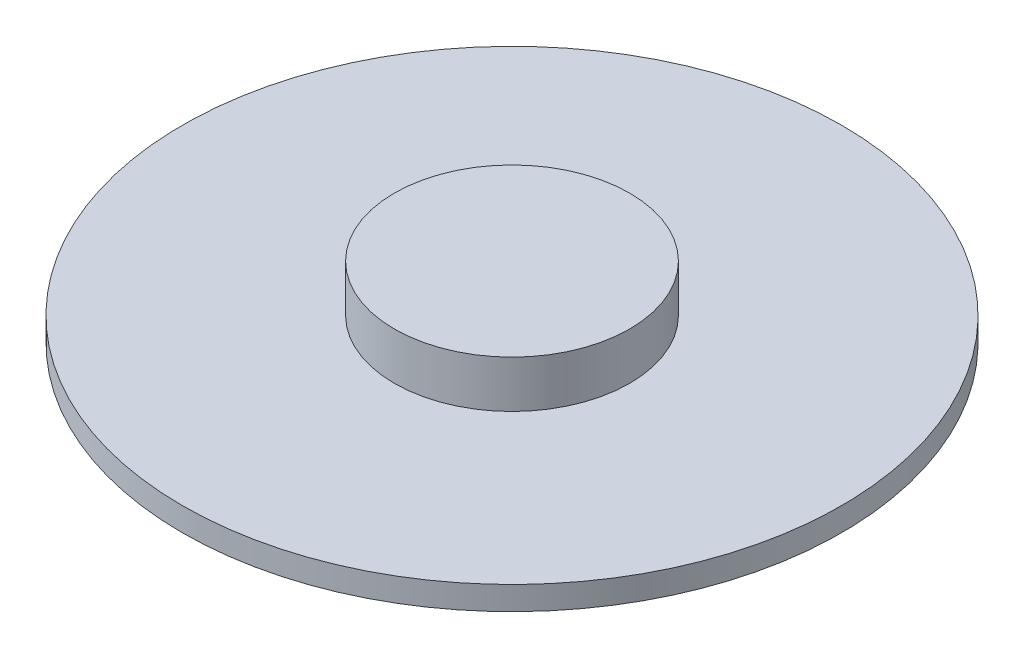
ISO-10303-21;
HEADER;
FILE_DESCRIPTION(('STEP AP214'),'2;1');
FILE_NAME('part.step','',(''),(''),'','','');
FILE_SCHEMA(('AUTOMOTIVE_DESIGN { 1 0 10303 214 1 1 1 1 }'));
ENDSEC;
DATA;
#1=APPLICATION_CONTEXT('core data for automotive mechanical design processes');
#2=APPLICATION_PROTOCOL_DEFINITION('international standard','automotive_design',2000,#1);
#3=PRODUCT_CONTEXT('',#1,'mechanical');
#4=PRODUCT('Part','Part','',(#3));
#5=PRODUCT_RELATED_PRODUCT_CATEGORY('part','',(#4));
#6=PRODUCT_DEFINITION_FORMATION('','',#4);
#7=PRODUCT_DEFINITION_CONTEXT('part definition',#1,'design');
#8=PRODUCT_DEFINITION('design','',#6,#7);
#9=PRODUCT_DEFINITION_SHAPE('','',#8);
#10=(LENGTH_UNIT() NAMED_UNIT(*) SI_UNIT(.MILLI.,.METRE.));
#11=(NAMED_UNIT(*) PLANE_ANGLE_UNIT() SI_UNIT($,.RADIAN.));
#12=(NAMED_UNIT(*) SI_UNIT($,.STERADIAN.) SOLID_ANGLE_UNIT());
#13=UNCERTAINTY_MEASURE_WITH_UNIT(LENGTH_MEASURE(1.E-05),#10,'distance_accuracy_value','');
#14=(GEOMETRIC_REPRESENTATION_CONTEXT(3) GLOBAL_UNCERTAINTY_ASSIGNED_CONTEXT((#13)) GLOBAL_UNIT_ASSIGNED_CONTEXT((#10,
#11,#12)) REPRESENTATION_CONTEXT('',''));
#15=CARTESIAN_POINT('',(0.,0.,0.));
#16=DIRECTION('',(0.,0.,1.));
#17=DIRECTION('',(1.,0.,0.));
#18=AXIS2_PLACEMENT_3D('',#15,#16,#17);
#19=CARTESIAN_POINT('',(0.,5.,0.));
#20=DIRECTION('',(0.,-1.,0.));
#21=DIRECTION('',(0.,0.,-1.));
#22=AXIS2_PLACEMENT_3D('',#19,#20,#21);
#23=CYLINDRICAL_SURFACE('',#22,70.);
#24=CARTESIAN_POINT('',(0.,5.,0.));
#25=DIRECTION('',(0.,1.,0.));
#26=DIRECTION('',(0.,0.,1.));
#27=AXIS2_PLACEMENT_3D('',#24,#25,#26);
#28=CIRCLE('',#27,70.);
#29=CARTESIAN_POINT('',(0.,5.,70.));
#30=VERTEX_POINT('',#29);
#31=EDGE_CURVE('E38',#30,#30,#28,.T.);
#32=ORIENTED_EDGE('',*,*,#31,.F.);
#33=EDGE_LOOP('',(#32));
#34=FACE_BOUND('',#33,.T.);
#35=CARTESIAN_POINT('',(0.,0.,0.));
#36=DIRECTION('',(0.,1.,0.));
#37=DIRECTION('',(0.,0.,1.));
#38=AXIS2_PLACEMENT_3D('',#35,#36,#37);
#39=CIRCLE('',#38,70.);
#40=CARTESIAN_POINT('',(0.,0.,70.));
#41=VERTEX_POINT('',#40);
#42=EDGE_CURVE('E34',#41,#41,#39,.T.);
#43=ORIENTED_EDGE('',*,*,#42,.T.);
#44=EDGE_LOOP('',(#43));
#45=FACE_BOUND('',#44,.T.);
#46=ADVANCED_FACE('F31',(#34,#45),#23,.T.);
#47=CARTESIAN_POINT('',(0.,5.,0.));
#48=DIRECTION('',(0.,1.,0.));
#49=DIRECTION('',(0.,0.,1.));
#50=AXIS2_PLACEMENT_3D('',#47,#48,#49);
#51=PLANE('',#50);
#52=CARTESIAN_POINT('',(0.,5.,0.));
#53=DIRECTION('',(0.,1.,0.));
#54=DIRECTION('',(0.,0.,1.));
#55=AXIS2_PLACEMENT_3D('',#52,#53,#54);
#56=CIRCLE('',#55,25.);
#57=CARTESIAN_POINT('',(0.,5.,25.));
#58=VERTEX_POINT('',#57);
#59=EDGE_CURVE('E10',#58,#58,#56,.T.);
#60=ORIENTED_EDGE('',*,*,#59,.F.);
#61=EDGE_LOOP('',(#60));
#62=FACE_BOUND('',#61,.T.);
#63=ORIENTED_EDGE('',*,*,#31,.T.);
#64=EDGE_LOOP('',(#63));
#65=FACE_BOUND('',#64,.T.);
#66=ADVANCED_FACE('F55',(#62,#65),#51,.T.);
#67=CARTESIAN_POINT('',(0.,0.,0.));
#68=DIRECTION('',(0.,1.,0.));
#69=DIRECTION('',(0.,0.,1.));
#70=AXIS2_PLACEMENT_3D('',#67,#68,#69);
#71=PLANE('',#70);
#72=ORIENTED_EDGE('',*,*,#42,.F.);
#73=EDGE_LOOP('',(#72));
#74=FACE_BOUND('',#73,.T.);
#75=ADVANCED_FACE('F52',(#74),#71,.F.);
#76=CARTESIAN_POINT('',(0.,15.,0.));
#77=DIRECTION('',(0.,-1.,0.));
#78=DIRECTION('',(0.,0.,-1.));
#79=AXIS2_PLACEMENT_3D('',#76,#77,#78);
#80=CYLINDRICAL_SURFACE('',#79,25.);
#81=CARTESIAN_POINT('',(0.,15.,0.));
#82=DIRECTION('',(0.,1.,0.));
#83=DIRECTION('',(0.,0.,1.));
#84=AXIS2_PLACEMENT_3D('',#81,#82,#83);
#85=CIRCLE('',#84,25.);
#86=CARTESIAN_POINT('',(0.,15.,25.));
#87=VERTEX_POINT('',#86);
#88=EDGE_CURVE('E44',#87,#87,#85,.T.);
#89=ORIENTED_EDGE('',*,*,#88,.F.);
#90=EDGE_LOOP('',(#89));
#91=FACE_BOUND('',#90,.T.);
#92=ORIENTED_EDGE('',*,*,#59,.T.);
#93=EDGE_LOOP('',(#92));
#94=FACE_BOUND('',#93,.T.);
#95=ADVANCED_FACE('F54',(#91,#94),#80,.T.);
#96=CARTESIAN_POINT('',(0.,15.,0.));
#97=DIRECTION('',(0.,1.,0.));
#98=DIRECTION('',(0.,0.,1.));
#99=AXIS2_PLACEMENT_3D('',#96,#97,#98);
#100=PLANE('',#99);
#101=ORIENTED_EDGE('',*,*,#88,.T.);
#102=EDGE_LOOP('',(#101));
#103=FACE_BOUND('',#102,.T.);
#104=ADVANCED_FACE('F60',(#103),#100,.T.);
#105=CLOSED_SHELL('',(#46,#66,#75,#95,#104));
#106=MANIFOLD_SOLID_BREP('B2',#105);
#107=ADVANCED_BREP_SHAPE_REPRESENTATION('',(#18,#106),#14);
#108=SHAPE_DEFINITION_REPRESENTATION(#9,#107);
ENDSEC;
END-ISO-10303-21;
